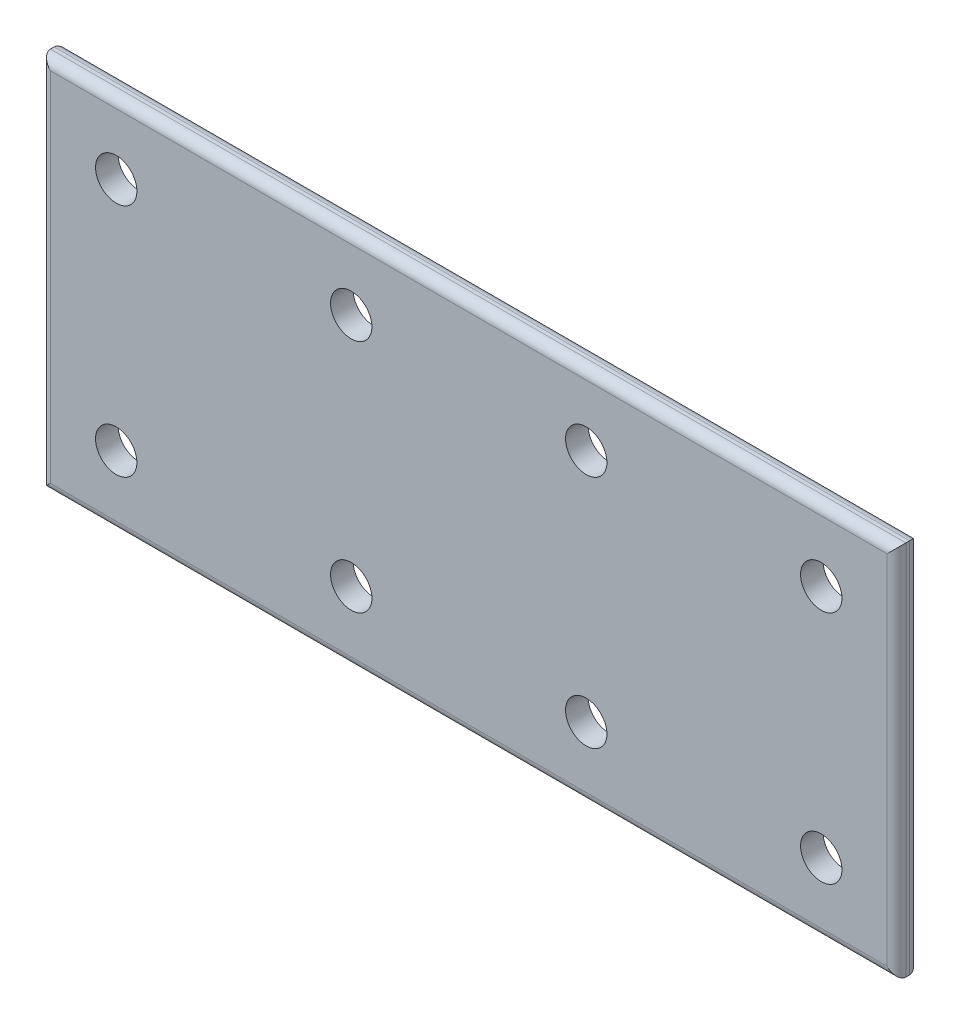
ISO-10303-21;
HEADER;
FILE_DESCRIPTION(('STEP AP214'),'2;1');
FILE_NAME('part.step','',(''),(''),'','','');
FILE_SCHEMA(('AUTOMOTIVE_DESIGN { 1 0 10303 214 1 1 1 1 }'));
ENDSEC;
DATA;
#1=APPLICATION_CONTEXT('core data for automotive mechanical design processes');
#2=APPLICATION_PROTOCOL_DEFINITION('international standard','automotive_design',2000,#1);
#3=PRODUCT_CONTEXT('',#1,'mechanical');
#4=PRODUCT('Part','Part','',(#3));
#5=PRODUCT_RELATED_PRODUCT_CATEGORY('part','',(#4));
#6=PRODUCT_DEFINITION_FORMATION('','',#4);
#7=PRODUCT_DEFINITION_CONTEXT('part definition',#1,'design');
#8=PRODUCT_DEFINITION('design','',#6,#7);
#9=PRODUCT_DEFINITION_SHAPE('','',#8);
#10=(LENGTH_UNIT() NAMED_UNIT(*) SI_UNIT(.MILLI.,.METRE.));
#11=(NAMED_UNIT(*) PLANE_ANGLE_UNIT() SI_UNIT($,.RADIAN.));
#12=(NAMED_UNIT(*) SI_UNIT($,.STERADIAN.) SOLID_ANGLE_UNIT());
#13=UNCERTAINTY_MEASURE_WITH_UNIT(LENGTH_MEASURE(1.E-05),#10,'distance_accuracy_value','');
#14=(GEOMETRIC_REPRESENTATION_CONTEXT(3) GLOBAL_UNCERTAINTY_ASSIGNED_CONTEXT((#13)) GLOBAL_UNIT_ASSIGNED_CONTEXT((#10,
#11,#12)) REPRESENTATION_CONTEXT('',''));
#15=CARTESIAN_POINT('',(0.,0.,0.));
#16=DIRECTION('',(0.,0.,1.));
#17=DIRECTION('',(1.,0.,0.));
#18=AXIS2_PLACEMENT_3D('',#15,#16,#17);
#19=CARTESIAN_POINT('',(0.,0.,12.));
#20=DIRECTION('',(1.,0.,0.));
#21=DIRECTION('',(0.,0.,-1.));
#22=AXIS2_PLACEMENT_3D('',#19,#20,#21);
#23=PLANE('',#22);
#24=DIRECTION('',(0.,0.,-1.));
#25=VECTOR('',#24,1.);
#26=CARTESIAN_POINT('',(0.,200.,12.));
#27=LINE('',#26,#25);
#28=CARTESIAN_POINT('',(0.,200.,7.));
#29=VERTEX_POINT('',#28);
#30=CARTESIAN_POINT('',(0.,200.,5.));
#31=VERTEX_POINT('',#30);
#32=EDGE_CURVE('E190',#29,#31,#27,.T.);
#33=ORIENTED_EDGE('',*,*,#32,.T.);
#34=DIRECTION('',(0.,-1.,0.));
#35=VECTOR('',#34,1.);
#36=CARTESIAN_POINT('',(0.,0.,5.));
#37=LINE('',#36,#35);
#38=CARTESIAN_POINT('',(0.,0.,5.));
#39=VERTEX_POINT('',#38);
#40=EDGE_CURVE('E137',#31,#39,#37,.T.);
#41=ORIENTED_EDGE('',*,*,#40,.T.);
#42=DIRECTION('',(0.,0.,-1.));
#43=VECTOR('',#42,1.);
#44=CARTESIAN_POINT('',(0.,0.,12.));
#45=LINE('',#44,#43);
#46=CARTESIAN_POINT('',(0.,0.,7.));
#47=VERTEX_POINT('',#46);
#48=EDGE_CURVE('E187',#47,#39,#45,.T.);
#49=ORIENTED_EDGE('',*,*,#48,.F.);
#50=DIRECTION('',(0.,-1.,0.));
#51=VECTOR('',#50,1.);
#52=CARTESIAN_POINT('',(0.,0.,7.));
#53=LINE('',#52,#51);
#54=EDGE_CURVE('E134',#47,#29,#53,.F.);
#55=ORIENTED_EDGE('',*,*,#54,.T.);
#56=EDGE_LOOP('',(#33,#41,#49,#55));
#57=FACE_BOUND('',#56,.T.);
#58=ADVANCED_FACE('F32',(#57),#23,.F.);
#59=CARTESIAN_POINT('',(0.,0.,12.));
#60=DIRECTION('',(0.,1.,0.));
#61=DIRECTION('',(0.,0.,1.));
#62=AXIS2_PLACEMENT_3D('',#59,#60,#61);
#63=PLANE('',#62);
#64=ORIENTED_EDGE('',*,*,#48,.T.);
#65=DIRECTION('',(1.,0.,0.));
#66=VECTOR('',#65,1.);
#67=CARTESIAN_POINT('',(455.,0.,5.));
#68=LINE('',#67,#66);
#69=CARTESIAN_POINT('',(455.,0.,5.));
#70=VERTEX_POINT('',#69);
#71=EDGE_CURVE('E56',#39,#70,#68,.T.);
#72=ORIENTED_EDGE('',*,*,#71,.T.);
#73=DIRECTION('',(0.,0.,-1.));
#74=VECTOR('',#73,1.);
#75=CARTESIAN_POINT('',(455.,0.,12.));
#76=LINE('',#75,#74);
#77=CARTESIAN_POINT('',(455.,0.,7.));
#78=VERTEX_POINT('',#77);
#79=EDGE_CURVE('E194',#78,#70,#76,.T.);
#80=ORIENTED_EDGE('',*,*,#79,.F.);
#81=DIRECTION('',(1.,0.,0.));
#82=VECTOR('',#81,1.);
#83=CARTESIAN_POINT('',(0.,0.,7.));
#84=LINE('',#83,#82);
#85=EDGE_CURVE('E128',#78,#47,#84,.F.);
#86=ORIENTED_EDGE('',*,*,#85,.T.);
#87=EDGE_LOOP('',(#64,#72,#80,#86));
#88=FACE_BOUND('',#87,.T.);
#89=ADVANCED_FACE('F191',(#88),#63,.F.);
#90=CARTESIAN_POINT('',(455.,0.,12.));
#91=DIRECTION('',(-1.,0.,0.));
#92=DIRECTION('',(0.,0.,1.));
#93=AXIS2_PLACEMENT_3D('',#90,#91,#92);
#94=PLANE('',#93);
#95=ORIENTED_EDGE('',*,*,#79,.T.);
#96=DIRECTION('',(0.,1.,0.));
#97=VECTOR('',#96,1.);
#98=CARTESIAN_POINT('',(455.,200.,5.));
#99=LINE('',#98,#97);
#100=CARTESIAN_POINT('',(455.,200.,5.));
#101=VERTEX_POINT('',#100);
#102=EDGE_CURVE('E41',#70,#101,#99,.T.);
#103=ORIENTED_EDGE('',*,*,#102,.T.);
#104=DIRECTION('',(0.,0.,-1.));
#105=VECTOR('',#104,1.);
#106=CARTESIAN_POINT('',(455.,200.,12.));
#107=LINE('',#106,#105);
#108=CARTESIAN_POINT('',(455.,200.,7.));
#109=VERTEX_POINT('',#108);
#110=EDGE_CURVE('E199',#109,#101,#107,.T.);
#111=ORIENTED_EDGE('',*,*,#110,.F.);
#112=DIRECTION('',(0.,1.,0.));
#113=VECTOR('',#112,1.);
#114=CARTESIAN_POINT('',(455.,0.,7.));
#115=LINE('',#114,#113);
#116=EDGE_CURVE('E107',#109,#78,#115,.F.);
#117=ORIENTED_EDGE('',*,*,#116,.T.);
#118=EDGE_LOOP('',(#95,#103,#111,#117));
#119=FACE_BOUND('',#118,.T.);
#120=ADVANCED_FACE('F238',(#119),#94,.F.);
#121=CARTESIAN_POINT('',(0.,200.,12.));
#122=DIRECTION('',(0.,-1.,0.));
#123=DIRECTION('',(0.,0.,-1.));
#124=AXIS2_PLACEMENT_3D('',#121,#122,#123);
#125=PLANE('',#124);
#126=ORIENTED_EDGE('',*,*,#110,.T.);
#127=DIRECTION('',(-1.,0.,0.));
#128=VECTOR('',#127,1.);
#129=CARTESIAN_POINT('',(0.,200.,5.));
#130=LINE('',#129,#128);
#131=EDGE_CURVE('E11',#101,#31,#130,.T.);
#132=ORIENTED_EDGE('',*,*,#131,.T.);
#133=ORIENTED_EDGE('',*,*,#32,.F.);
#134=DIRECTION('',(-1.,0.,0.));
#135=VECTOR('',#134,1.);
#136=CARTESIAN_POINT('',(0.,200.,7.));
#137=LINE('',#136,#135);
#138=EDGE_CURVE('E136',#29,#109,#137,.F.);
#139=ORIENTED_EDGE('',*,*,#138,.T.);
#140=EDGE_LOOP('',(#126,#132,#133,#139));
#141=FACE_BOUND('',#140,.T.);
#142=ADVANCED_FACE('F264',(#141),#125,.F.);
#143=CARTESIAN_POINT('',(0.,200.,12.));
#144=DIRECTION('',(0.,0.,-1.));
#145=DIRECTION('',(-1.,0.,0.));
#146=AXIS2_PLACEMENT_3D('',#143,#144,#145);
#147=PLANE('',#146);
#148=DIRECTION('',(1.,0.,0.));
#149=VECTOR('',#148,1.);
#150=CARTESIAN_POINT('',(0.,5.,12.));
#151=LINE('',#150,#149);
#152=CARTESIAN_POINT('',(5.,5.,12.));
#153=VERTEX_POINT('',#152);
#154=CARTESIAN_POINT('',(450.,5.,12.));
#155=VERTEX_POINT('',#154);
#156=EDGE_CURVE('E125',#153,#155,#151,.T.);
#157=ORIENTED_EDGE('',*,*,#156,.T.);
#158=DIRECTION('',(0.,1.,0.));
#159=VECTOR('',#158,1.);
#160=CARTESIAN_POINT('',(450.,200.,12.));
#161=LINE('',#160,#159);
#162=CARTESIAN_POINT('',(450.,195.,12.));
#163=VERTEX_POINT('',#162);
#164=EDGE_CURVE('E105',#155,#163,#161,.T.);
#165=ORIENTED_EDGE('',*,*,#164,.T.);
#166=DIRECTION('',(-1.,0.,0.));
#167=VECTOR('',#166,1.);
#168=CARTESIAN_POINT('',(0.,195.,12.));
#169=LINE('',#168,#167);
#170=CARTESIAN_POINT('',(5.,195.,12.));
#171=VERTEX_POINT('',#170);
#172=EDGE_CURVE('E113',#163,#171,#169,.T.);
#173=ORIENTED_EDGE('',*,*,#172,.T.);
#174=DIRECTION('',(0.,-1.,0.));
#175=VECTOR('',#174,1.);
#176=CARTESIAN_POINT('',(5.,200.,12.));
#177=LINE('',#176,#175);
#178=EDGE_CURVE('E119',#171,#153,#177,.T.);
#179=ORIENTED_EDGE('',*,*,#178,.T.);
#180=EDGE_LOOP('',(#157,#165,#173,#179));
#181=FACE_BOUND('',#180,.T.);
#182=CARTESIAN_POINT('',(165.,37.5,12.));
#183=DIRECTION('',(0.,0.,1.));
#184=DIRECTION('',(1.,0.,0.));
#185=AXIS2_PLACEMENT_3D('',#182,#183,#184);
#186=CIRCLE('',#185,11.);
#187=CARTESIAN_POINT('',(176.,37.5,12.));
#188=VERTEX_POINT('',#187);
#189=EDGE_CURVE('E246',#188,#188,#186,.T.);
#190=ORIENTED_EDGE('',*,*,#189,.F.);
#191=EDGE_LOOP('',(#190));
#192=FACE_BOUND('',#191,.T.);
#193=CARTESIAN_POINT('',(40.,37.5,12.));
#194=DIRECTION('',(0.,0.,1.));
#195=DIRECTION('',(1.,0.,0.));
#196=AXIS2_PLACEMENT_3D('',#193,#194,#195);
#197=CIRCLE('',#196,11.);
#198=CARTESIAN_POINT('',(51.,37.5,12.));
#199=VERTEX_POINT('',#198);
#200=EDGE_CURVE('E243',#199,#199,#197,.T.);
#201=ORIENTED_EDGE('',*,*,#200,.F.);
#202=EDGE_LOOP('',(#201));
#203=FACE_BOUND('',#202,.T.);
#204=CARTESIAN_POINT('',(290.,37.5,12.));
#205=DIRECTION('',(0.,0.,1.));
#206=DIRECTION('',(1.,0.,0.));
#207=AXIS2_PLACEMENT_3D('',#204,#205,#206);
#208=CIRCLE('',#207,11.);
#209=CARTESIAN_POINT('',(301.,37.5,12.));
#210=VERTEX_POINT('',#209);
#211=EDGE_CURVE('E197',#210,#210,#208,.T.);
#212=ORIENTED_EDGE('',*,*,#211,.F.);
#213=EDGE_LOOP('',(#212));
#214=FACE_BOUND('',#213,.T.);
#215=CARTESIAN_POINT('',(415.,37.5,12.));
#216=DIRECTION('',(0.,0.,1.));
#217=DIRECTION('',(1.,0.,0.));
#218=AXIS2_PLACEMENT_3D('',#215,#216,#217);
#219=CIRCLE('',#218,11.);
#220=CARTESIAN_POINT('',(426.,37.5,12.));
#221=VERTEX_POINT('',#220);
#222=EDGE_CURVE('E208',#221,#221,#219,.T.);
#223=ORIENTED_EDGE('',*,*,#222,.F.);
#224=EDGE_LOOP('',(#223));
#225=FACE_BOUND('',#224,.T.);
#226=CARTESIAN_POINT('',(40.,162.5,12.));
#227=DIRECTION('',(0.,0.,1.));
#228=DIRECTION('',(1.,0.,0.));
#229=AXIS2_PLACEMENT_3D('',#226,#227,#228);
#230=CIRCLE('',#229,11.);
#231=CARTESIAN_POINT('',(51.,162.5,12.));
#232=VERTEX_POINT('',#231);
#233=EDGE_CURVE('E214',#232,#232,#230,.T.);
#234=ORIENTED_EDGE('',*,*,#233,.F.);
#235=EDGE_LOOP('',(#234));
#236=FACE_BOUND('',#235,.T.);
#237=CARTESIAN_POINT('',(165.,162.5,12.));
#238=DIRECTION('',(0.,0.,1.));
#239=DIRECTION('',(1.,0.,0.));
#240=AXIS2_PLACEMENT_3D('',#237,#238,#239);
#241=CIRCLE('',#240,11.);
#242=CARTESIAN_POINT('',(176.,162.5,12.));
#243=VERTEX_POINT('',#242);
#244=EDGE_CURVE('E220',#243,#243,#241,.T.);
#245=ORIENTED_EDGE('',*,*,#244,.F.);
#246=EDGE_LOOP('',(#245));
#247=FACE_BOUND('',#246,.T.);
#248=CARTESIAN_POINT('',(290.,162.5,12.));
#249=DIRECTION('',(0.,0.,1.));
#250=DIRECTION('',(1.,0.,0.));
#251=AXIS2_PLACEMENT_3D('',#248,#249,#250);
#252=CIRCLE('',#251,11.);
#253=CARTESIAN_POINT('',(301.,162.5,12.));
#254=VERTEX_POINT('',#253);
#255=EDGE_CURVE('E226',#254,#254,#252,.T.);
#256=ORIENTED_EDGE('',*,*,#255,.F.);
#257=EDGE_LOOP('',(#256));
#258=FACE_BOUND('',#257,.T.);
#259=CARTESIAN_POINT('',(415.,162.5,12.));
#260=DIRECTION('',(0.,0.,1.));
#261=DIRECTION('',(1.,0.,0.));
#262=AXIS2_PLACEMENT_3D('',#259,#260,#261);
#263=CIRCLE('',#262,11.);
#264=CARTESIAN_POINT('',(426.,162.5,12.));
#265=VERTEX_POINT('',#264);
#266=EDGE_CURVE('E120',#265,#265,#263,.T.);
#267=ORIENTED_EDGE('',*,*,#266,.F.);
#268=EDGE_LOOP('',(#267));
#269=FACE_BOUND('',#268,.T.);
#270=ADVANCED_FACE('F122',(#181,#192,#203,#214,#225,#236,#247,#258,#269),#147,.F.);
#271=CARTESIAN_POINT('',(0.,200.,0.));
#272=DIRECTION('',(0.,0.,-1.));
#273=DIRECTION('',(-1.,0.,0.));
#274=AXIS2_PLACEMENT_3D('',#271,#272,#273);
#275=PLANE('',#274);
#276=DIRECTION('',(1.,0.,0.));
#277=VECTOR('',#276,1.);
#278=CARTESIAN_POINT('',(0.,5.,0.));
#279=LINE('',#278,#277);
#280=CARTESIAN_POINT('',(450.,5.,0.));
#281=VERTEX_POINT('',#280);
#282=CARTESIAN_POINT('',(5.,5.,0.));
#283=VERTEX_POINT('',#282);
#284=EDGE_CURVE('E151',#281,#283,#279,.F.);
#285=ORIENTED_EDGE('',*,*,#284,.T.);
#286=DIRECTION('',(0.,-1.,0.));
#287=VECTOR('',#286,1.);
#288=CARTESIAN_POINT('',(5.,200.,0.));
#289=LINE('',#288,#287);
#290=CARTESIAN_POINT('',(5.,195.,0.));
#291=VERTEX_POINT('',#290);
#292=EDGE_CURVE('E153',#283,#291,#289,.F.);
#293=ORIENTED_EDGE('',*,*,#292,.T.);
#294=DIRECTION('',(-1.,0.,0.));
#295=VECTOR('',#294,1.);
#296=CARTESIAN_POINT('',(455.,195.,0.));
#297=LINE('',#296,#295);
#298=CARTESIAN_POINT('',(450.,195.,0.));
#299=VERTEX_POINT('',#298);
#300=EDGE_CURVE('E147',#291,#299,#297,.F.);
#301=ORIENTED_EDGE('',*,*,#300,.T.);
#302=DIRECTION('',(0.,1.,0.));
#303=VECTOR('',#302,1.);
#304=CARTESIAN_POINT('',(450.,0.,0.));
#305=LINE('',#304,#303);
#306=EDGE_CURVE('E149',#299,#281,#305,.F.);
#307=ORIENTED_EDGE('',*,*,#306,.T.);
#308=EDGE_LOOP('',(#285,#293,#301,#307));
#309=FACE_BOUND('',#308,.T.);
#310=CARTESIAN_POINT('',(165.,37.5,0.));
#311=DIRECTION('',(0.,0.,1.));
#312=DIRECTION('',(1.,0.,0.));
#313=AXIS2_PLACEMENT_3D('',#310,#311,#312);
#314=CIRCLE('',#313,11.);
#315=CARTESIAN_POINT('',(176.,37.5,0.));
#316=VERTEX_POINT('',#315);
#317=EDGE_CURVE('E144',#316,#316,#314,.T.);
#318=ORIENTED_EDGE('',*,*,#317,.T.);
#319=EDGE_LOOP('',(#318));
#320=FACE_BOUND('',#319,.T.);
#321=CARTESIAN_POINT('',(40.,37.5,0.));
#322=DIRECTION('',(0.,0.,1.));
#323=DIRECTION('',(1.,0.,0.));
#324=AXIS2_PLACEMENT_3D('',#321,#322,#323);
#325=CIRCLE('',#324,11.);
#326=CARTESIAN_POINT('',(51.,37.5,0.));
#327=VERTEX_POINT('',#326);
#328=EDGE_CURVE('E240',#327,#327,#325,.T.);
#329=ORIENTED_EDGE('',*,*,#328,.T.);
#330=EDGE_LOOP('',(#329));
#331=FACE_BOUND('',#330,.T.);
#332=CARTESIAN_POINT('',(290.,37.5,0.));
#333=DIRECTION('',(0.,0.,1.));
#334=DIRECTION('',(1.,0.,0.));
#335=AXIS2_PLACEMENT_3D('',#332,#333,#334);
#336=CIRCLE('',#335,11.);
#337=CARTESIAN_POINT('',(301.,37.5,0.));
#338=VERTEX_POINT('',#337);
#339=EDGE_CURVE('E193',#338,#338,#336,.T.);
#340=ORIENTED_EDGE('',*,*,#339,.T.);
#341=EDGE_LOOP('',(#340));
#342=FACE_BOUND('',#341,.T.);
#343=CARTESIAN_POINT('',(415.,37.5,0.));
#344=DIRECTION('',(0.,0.,1.));
#345=DIRECTION('',(1.,0.,0.));
#346=AXIS2_PLACEMENT_3D('',#343,#344,#345);
#347=CIRCLE('',#346,11.);
#348=CARTESIAN_POINT('',(426.,37.5,0.));
#349=VERTEX_POINT('',#348);
#350=EDGE_CURVE('E205',#349,#349,#347,.T.);
#351=ORIENTED_EDGE('',*,*,#350,.T.);
#352=EDGE_LOOP('',(#351));
#353=FACE_BOUND('',#352,.T.);
#354=CARTESIAN_POINT('',(40.,162.5,0.));
#355=DIRECTION('',(0.,0.,1.));
#356=DIRECTION('',(1.,0.,0.));
#357=AXIS2_PLACEMENT_3D('',#354,#355,#356);
#358=CIRCLE('',#357,11.);
#359=CARTESIAN_POINT('',(51.,162.5,0.));
#360=VERTEX_POINT('',#359);
#361=EDGE_CURVE('E211',#360,#360,#358,.T.);
#362=ORIENTED_EDGE('',*,*,#361,.T.);
#363=EDGE_LOOP('',(#362));
#364=FACE_BOUND('',#363,.T.);
#365=CARTESIAN_POINT('',(165.,162.5,0.));
#366=DIRECTION('',(0.,0.,1.));
#367=DIRECTION('',(1.,0.,0.));
#368=AXIS2_PLACEMENT_3D('',#365,#366,#367);
#369=CIRCLE('',#368,11.);
#370=CARTESIAN_POINT('',(176.,162.5,0.));
#371=VERTEX_POINT('',#370);
#372=EDGE_CURVE('E217',#371,#371,#369,.T.);
#373=ORIENTED_EDGE('',*,*,#372,.T.);
#374=EDGE_LOOP('',(#373));
#375=FACE_BOUND('',#374,.T.);
#376=CARTESIAN_POINT('',(290.,162.5,0.));
#377=DIRECTION('',(0.,0.,1.));
#378=DIRECTION('',(1.,0.,0.));
#379=AXIS2_PLACEMENT_3D('',#376,#377,#378);
#380=CIRCLE('',#379,11.);
#381=CARTESIAN_POINT('',(301.,162.5,0.));
#382=VERTEX_POINT('',#381);
#383=EDGE_CURVE('E223',#382,#382,#380,.T.);
#384=ORIENTED_EDGE('',*,*,#383,.T.);
#385=EDGE_LOOP('',(#384));
#386=FACE_BOUND('',#385,.T.);
#387=CARTESIAN_POINT('',(415.,162.5,0.));
#388=DIRECTION('',(0.,0.,1.));
#389=DIRECTION('',(1.,0.,0.));
#390=AXIS2_PLACEMENT_3D('',#387,#388,#389);
#391=CIRCLE('',#390,11.);
#392=CARTESIAN_POINT('',(426.,162.5,0.));
#393=VERTEX_POINT('',#392);
#394=EDGE_CURVE('E229',#393,#393,#391,.T.);
#395=ORIENTED_EDGE('',*,*,#394,.T.);
#396=EDGE_LOOP('',(#395));
#397=FACE_BOUND('',#396,.T.);
#398=ADVANCED_FACE('F176',(#309,#320,#331,#342,#353,#364,#375,#386,#397),#275,.T.);
#399=CARTESIAN_POINT('',(40.,37.5,0.));
#400=DIRECTION('',(0.,0.,1.));
#401=DIRECTION('',(1.,0.,0.));
#402=AXIS2_PLACEMENT_3D('',#399,#400,#401);
#403=CYLINDRICAL_SURFACE('',#402,11.);
#404=ORIENTED_EDGE('',*,*,#328,.F.);
#405=EDGE_LOOP('',(#404));
#406=FACE_BOUND('',#405,.T.);
#407=ORIENTED_EDGE('',*,*,#200,.T.);
#408=EDGE_LOOP('',(#407));
#409=FACE_BOUND('',#408,.T.);
#410=ADVANCED_FACE('F259',(#406,#409),#403,.F.);
#411=CARTESIAN_POINT('',(165.,37.5,0.));
#412=DIRECTION('',(0.,0.,1.));
#413=DIRECTION('',(1.,0.,0.));
#414=AXIS2_PLACEMENT_3D('',#411,#412,#413);
#415=CYLINDRICAL_SURFACE('',#414,11.);
#416=ORIENTED_EDGE('',*,*,#317,.F.);
#417=EDGE_LOOP('',(#416));
#418=FACE_BOUND('',#417,.T.);
#419=ORIENTED_EDGE('',*,*,#189,.T.);
#420=EDGE_LOOP('',(#419));
#421=FACE_BOUND('',#420,.T.);
#422=ADVANCED_FACE('F255',(#418,#421),#415,.F.);
#423=CARTESIAN_POINT('',(290.,37.5,0.));
#424=DIRECTION('',(0.,0.,1.));
#425=DIRECTION('',(1.,0.,0.));
#426=AXIS2_PLACEMENT_3D('',#423,#424,#425);
#427=CYLINDRICAL_SURFACE('',#426,11.);
#428=ORIENTED_EDGE('',*,*,#339,.F.);
#429=EDGE_LOOP('',(#428));
#430=FACE_BOUND('',#429,.T.);
#431=ORIENTED_EDGE('',*,*,#211,.T.);
#432=EDGE_LOOP('',(#431));
#433=FACE_BOUND('',#432,.T.);
#434=ADVANCED_FACE('F258',(#430,#433),#427,.F.);
#435=CARTESIAN_POINT('',(415.,37.5,0.));
#436=DIRECTION('',(0.,0.,1.));
#437=DIRECTION('',(1.,0.,0.));
#438=AXIS2_PLACEMENT_3D('',#435,#436,#437);
#439=CYLINDRICAL_SURFACE('',#438,11.);
#440=ORIENTED_EDGE('',*,*,#350,.F.);
#441=EDGE_LOOP('',(#440));
#442=FACE_BOUND('',#441,.T.);
#443=ORIENTED_EDGE('',*,*,#222,.T.);
#444=EDGE_LOOP('',(#443));
#445=FACE_BOUND('',#444,.T.);
#446=ADVANCED_FACE('F305',(#442,#445),#439,.F.);
#447=CARTESIAN_POINT('',(40.,162.5,0.));
#448=DIRECTION('',(0.,0.,1.));
#449=DIRECTION('',(1.,0.,0.));
#450=AXIS2_PLACEMENT_3D('',#447,#448,#449);
#451=CYLINDRICAL_SURFACE('',#450,11.);
#452=ORIENTED_EDGE('',*,*,#361,.F.);
#453=EDGE_LOOP('',(#452));
#454=FACE_BOUND('',#453,.T.);
#455=ORIENTED_EDGE('',*,*,#233,.T.);
#456=EDGE_LOOP('',(#455));
#457=FACE_BOUND('',#456,.T.);
#458=ADVANCED_FACE('F309',(#454,#457),#451,.F.);
#459=CARTESIAN_POINT('',(165.,162.5,0.));
#460=DIRECTION('',(0.,0.,1.));
#461=DIRECTION('',(1.,0.,0.));
#462=AXIS2_PLACEMENT_3D('',#459,#460,#461);
#463=CYLINDRICAL_SURFACE('',#462,11.);
#464=ORIENTED_EDGE('',*,*,#372,.F.);
#465=EDGE_LOOP('',(#464));
#466=FACE_BOUND('',#465,.T.);
#467=ORIENTED_EDGE('',*,*,#244,.T.);
#468=EDGE_LOOP('',(#467));
#469=FACE_BOUND('',#468,.T.);
#470=ADVANCED_FACE('F290',(#466,#469),#463,.F.);
#471=CARTESIAN_POINT('',(290.,162.5,0.));
#472=DIRECTION('',(0.,0.,1.));
#473=DIRECTION('',(1.,0.,0.));
#474=AXIS2_PLACEMENT_3D('',#471,#472,#473);
#475=CYLINDRICAL_SURFACE('',#474,11.);
#476=ORIENTED_EDGE('',*,*,#383,.F.);
#477=EDGE_LOOP('',(#476));
#478=FACE_BOUND('',#477,.T.);
#479=ORIENTED_EDGE('',*,*,#255,.T.);
#480=EDGE_LOOP('',(#479));
#481=FACE_BOUND('',#480,.T.);
#482=ADVANCED_FACE('F282',(#478,#481),#475,.F.);
#483=CARTESIAN_POINT('',(415.,162.5,0.));
#484=DIRECTION('',(0.,0.,1.));
#485=DIRECTION('',(1.,0.,0.));
#486=AXIS2_PLACEMENT_3D('',#483,#484,#485);
#487=CYLINDRICAL_SURFACE('',#486,11.);
#488=ORIENTED_EDGE('',*,*,#394,.F.);
#489=EDGE_LOOP('',(#488));
#490=FACE_BOUND('',#489,.T.);
#491=ORIENTED_EDGE('',*,*,#266,.T.);
#492=EDGE_LOOP('',(#491));
#493=FACE_BOUND('',#492,.T.);
#494=ADVANCED_FACE('F280',(#490,#493),#487,.F.);
#495=CARTESIAN_POINT('',(5.,200.,7.));
#496=DIRECTION('',(0.,-1.,0.));
#497=DIRECTION('',(0.,0.,-1.));
#498=AXIS2_PLACEMENT_3D('',#495,#496,#497);
#499=CYLINDRICAL_SURFACE('',#498,5.);
#500=CARTESIAN_POINT('',(5.,195.,7.));
#501=DIRECTION('',(-0.707106781186547,-0.707106781186547,0.));
#502=DIRECTION('',(-0.707106781186547,0.707106781186547,0.));
#503=AXIS2_PLACEMENT_3D('',#500,#501,#502);
#504=ELLIPSE('',#503,7.07106781186547,5.);
#505=EDGE_CURVE('E116',#29,#171,#504,.F.);
#506=ORIENTED_EDGE('',*,*,#505,.F.);
#507=ORIENTED_EDGE('',*,*,#54,.F.);
#508=CARTESIAN_POINT('',(5.,5.,7.));
#509=DIRECTION('',(0.707106781186547,-0.707106781186547,0.));
#510=DIRECTION('',(-0.707106781186547,-0.707106781186547,0.));
#511=AXIS2_PLACEMENT_3D('',#508,#509,#510);
#512=ELLIPSE('',#511,7.07106781186547,5.);
#513=EDGE_CURVE('E141',#153,#47,#512,.T.);
#514=ORIENTED_EDGE('',*,*,#513,.F.);
#515=ORIENTED_EDGE('',*,*,#178,.F.);
#516=EDGE_LOOP('',(#506,#507,#514,#515));
#517=FACE_BOUND('',#516,.T.);
#518=ADVANCED_FACE('F235',(#517),#499,.T.);
#519=CARTESIAN_POINT('',(0.,5.,7.));
#520=DIRECTION('',(1.,0.,0.));
#521=DIRECTION('',(0.,0.,-1.));
#522=AXIS2_PLACEMENT_3D('',#519,#520,#521);
#523=CYLINDRICAL_SURFACE('',#522,5.);
#524=ORIENTED_EDGE('',*,*,#513,.T.);
#525=ORIENTED_EDGE('',*,*,#85,.F.);
#526=CARTESIAN_POINT('',(450.,5.,7.));
#527=DIRECTION('',(0.707106781186547,0.707106781186547,0.));
#528=DIRECTION('',(0.707106781186547,-0.707106781186547,0.));
#529=AXIS2_PLACEMENT_3D('',#526,#527,#528);
#530=ELLIPSE('',#529,7.07106781186547,5.);
#531=EDGE_CURVE('E110',#155,#78,#530,.T.);
#532=ORIENTED_EDGE('',*,*,#531,.F.);
#533=ORIENTED_EDGE('',*,*,#156,.F.);
#534=EDGE_LOOP('',(#524,#525,#532,#533));
#535=FACE_BOUND('',#534,.T.);
#536=ADVANCED_FACE('F237',(#535),#523,.T.);
#537=CARTESIAN_POINT('',(0.,195.,7.));
#538=DIRECTION('',(-1.,0.,0.));
#539=DIRECTION('',(0.,0.,1.));
#540=AXIS2_PLACEMENT_3D('',#537,#538,#539);
#541=CYLINDRICAL_SURFACE('',#540,5.);
#542=ORIENTED_EDGE('',*,*,#505,.T.);
#543=ORIENTED_EDGE('',*,*,#172,.F.);
#544=CARTESIAN_POINT('',(450.,195.,7.));
#545=DIRECTION('',(-0.707106781186547,0.707106781186547,0.));
#546=DIRECTION('',(-0.707106781186547,-0.707106781186547,0.));
#547=AXIS2_PLACEMENT_3D('',#544,#545,#546);
#548=ELLIPSE('',#547,7.07106781186547,5.);
#549=EDGE_CURVE('E101',#109,#163,#548,.F.);
#550=ORIENTED_EDGE('',*,*,#549,.F.);
#551=ORIENTED_EDGE('',*,*,#138,.F.);
#552=EDGE_LOOP('',(#542,#543,#550,#551));
#553=FACE_BOUND('',#552,.T.);
#554=ADVANCED_FACE('F114',(#553),#541,.T.);
#555=CARTESIAN_POINT('',(450.,200.,7.));
#556=DIRECTION('',(0.,1.,0.));
#557=DIRECTION('',(0.,0.,1.));
#558=AXIS2_PLACEMENT_3D('',#555,#556,#557);
#559=CYLINDRICAL_SURFACE('',#558,5.);
#560=ORIENTED_EDGE('',*,*,#531,.T.);
#561=ORIENTED_EDGE('',*,*,#116,.F.);
#562=ORIENTED_EDGE('',*,*,#549,.T.);
#563=ORIENTED_EDGE('',*,*,#164,.F.);
#564=EDGE_LOOP('',(#560,#561,#562,#563));
#565=FACE_BOUND('',#564,.T.);
#566=ADVANCED_FACE('F103',(#565),#559,.T.);
#567=CARTESIAN_POINT('',(450.,0.,5.));
#568=DIRECTION('',(0.,-1.,0.));
#569=DIRECTION('',(0.,0.,-1.));
#570=AXIS2_PLACEMENT_3D('',#567,#568,#569);
#571=CYLINDRICAL_SURFACE('',#570,5.);
#572=CARTESIAN_POINT('',(450.,5.,5.));
#573=DIRECTION('',(-0.707106781186547,-0.707106781186547,0.));
#574=DIRECTION('',(0.707106781186547,-0.707106781186547,0.));
#575=AXIS2_PLACEMENT_3D('',#572,#573,#574);
#576=ELLIPSE('',#575,7.07106781186547,5.);
#577=EDGE_CURVE('E161',#281,#70,#576,.T.);
#578=ORIENTED_EDGE('',*,*,#577,.F.);
#579=ORIENTED_EDGE('',*,*,#306,.F.);
#580=CARTESIAN_POINT('',(450.,195.,5.));
#581=DIRECTION('',(0.707106781186547,-0.707106781186547,0.));
#582=DIRECTION('',(0.707106781186547,0.707106781186547,0.));
#583=AXIS2_PLACEMENT_3D('',#580,#581,#582);
#584=ELLIPSE('',#583,7.07106781186547,5.);
#585=EDGE_CURVE('E36',#101,#299,#584,.F.);
#586=ORIENTED_EDGE('',*,*,#585,.F.);
#587=ORIENTED_EDGE('',*,*,#102,.F.);
#588=EDGE_LOOP('',(#578,#579,#586,#587));
#589=FACE_BOUND('',#588,.T.);
#590=ADVANCED_FACE('F34',(#589),#571,.T.);
#591=CARTESIAN_POINT('',(0.,195.,5.));
#592=DIRECTION('',(1.,0.,0.));
#593=DIRECTION('',(0.,0.,-1.));
#594=AXIS2_PLACEMENT_3D('',#591,#592,#593);
#595=CYLINDRICAL_SURFACE('',#594,5.);
#596=ORIENTED_EDGE('',*,*,#585,.T.);
#597=ORIENTED_EDGE('',*,*,#300,.F.);
#598=CARTESIAN_POINT('',(5.,195.,5.));
#599=DIRECTION('',(0.707106781186547,0.707106781186547,0.));
#600=DIRECTION('',(0.707106781186547,-0.707106781186547,0.));
#601=AXIS2_PLACEMENT_3D('',#598,#599,#600);
#602=ELLIPSE('',#601,7.07106781186547,5.);
#603=EDGE_CURVE('E160',#31,#291,#602,.F.);
#604=ORIENTED_EDGE('',*,*,#603,.F.);
#605=ORIENTED_EDGE('',*,*,#131,.F.);
#606=EDGE_LOOP('',(#596,#597,#604,#605));
#607=FACE_BOUND('',#606,.T.);
#608=ADVANCED_FACE('F171',(#607),#595,.T.);
#609=CARTESIAN_POINT('',(0.,5.,5.));
#610=DIRECTION('',(-1.,0.,0.));
#611=DIRECTION('',(0.,0.,1.));
#612=AXIS2_PLACEMENT_3D('',#609,#610,#611);
#613=CYLINDRICAL_SURFACE('',#612,5.);
#614=ORIENTED_EDGE('',*,*,#577,.T.);
#615=ORIENTED_EDGE('',*,*,#71,.F.);
#616=CARTESIAN_POINT('',(5.,5.,5.));
#617=DIRECTION('',(-0.707106781186547,0.707106781186547,0.));
#618=DIRECTION('',(-0.707106781186547,-0.707106781186547,0.));
#619=AXIS2_PLACEMENT_3D('',#616,#617,#618);
#620=ELLIPSE('',#619,7.07106781186547,5.);
#621=EDGE_CURVE('E158',#283,#39,#620,.T.);
#622=ORIENTED_EDGE('',*,*,#621,.F.);
#623=ORIENTED_EDGE('',*,*,#284,.F.);
#624=EDGE_LOOP('',(#614,#615,#622,#623));
#625=FACE_BOUND('',#624,.T.);
#626=ADVANCED_FACE('F183',(#625),#613,.T.);
#627=CARTESIAN_POINT('',(5.,0.,5.));
#628=DIRECTION('',(0.,1.,0.));
#629=DIRECTION('',(0.,0.,1.));
#630=AXIS2_PLACEMENT_3D('',#627,#628,#629);
#631=CYLINDRICAL_SURFACE('',#630,5.);
#632=ORIENTED_EDGE('',*,*,#603,.T.);
#633=ORIENTED_EDGE('',*,*,#292,.F.);
#634=ORIENTED_EDGE('',*,*,#621,.T.);
#635=ORIENTED_EDGE('',*,*,#40,.F.);
#636=EDGE_LOOP('',(#632,#633,#634,#635));
#637=FACE_BOUND('',#636,.T.);
#638=ADVANCED_FACE('F181',(#637),#631,.T.);
#639=CLOSED_SHELL('',(#58,#89,#120,#142,#270,#398,#410,#422,#434,#446,#458,#470,#482,#494,#518,
#536,#554,#566,#590,#608,#626,#638));
#640=MANIFOLD_SOLID_BREP('B2',#639);
#641=ADVANCED_BREP_SHAPE_REPRESENTATION('',(#18,#640),#14);
#642=SHAPE_DEFINITION_REPRESENTATION(#9,#641);
ENDSEC;
END-ISO-10303-21;
